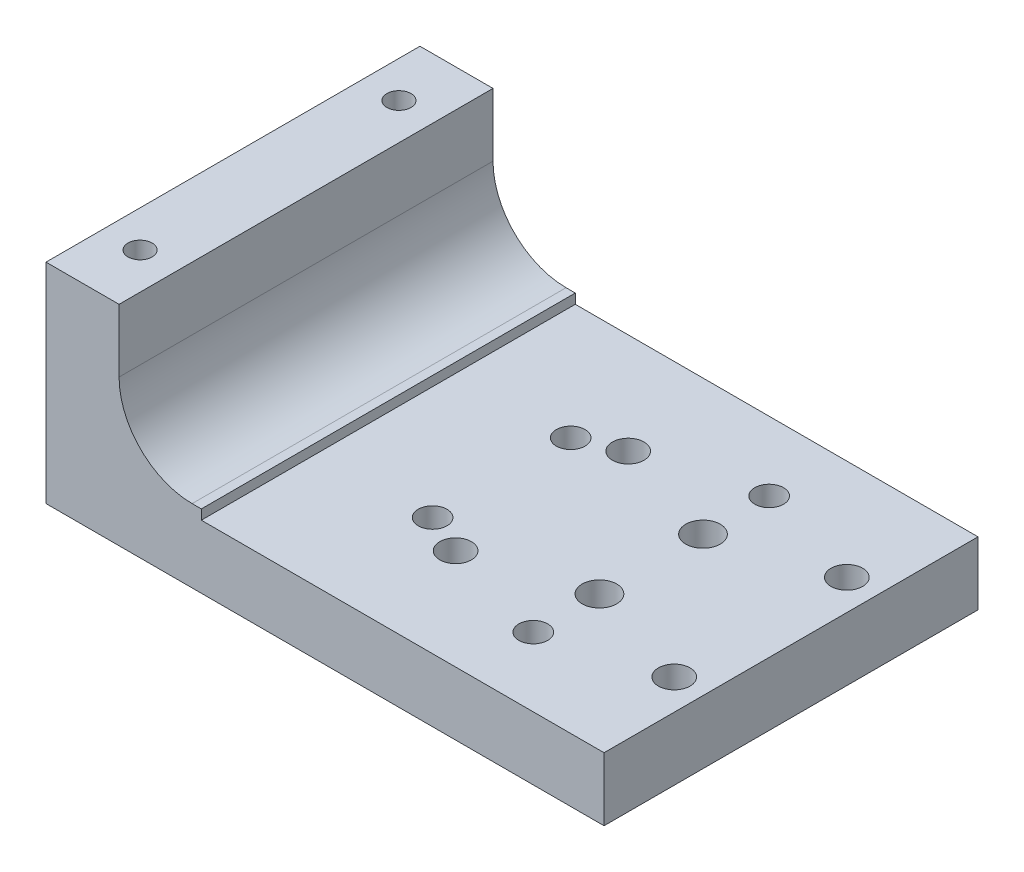
ISO-10303-21;
HEADER;
FILE_DESCRIPTION(('STEP AP214'),'2;1');
FILE_NAME('part.step','',(''),(''),'','','');
FILE_SCHEMA(('AUTOMOTIVE_DESIGN { 1 0 10303 214 1 1 1 1 }'));
ENDSEC;
DATA;
#1=APPLICATION_CONTEXT('core data for automotive mechanical design processes');
#2=APPLICATION_PROTOCOL_DEFINITION('international standard','automotive_design',2000,#1);
#3=PRODUCT_CONTEXT('',#1,'mechanical');
#4=PRODUCT('Part','Part','',(#3));
#5=PRODUCT_RELATED_PRODUCT_CATEGORY('part','',(#4));
#6=PRODUCT_DEFINITION_FORMATION('','',#4);
#7=PRODUCT_DEFINITION_CONTEXT('part definition',#1,'design');
#8=PRODUCT_DEFINITION('design','',#6,#7);
#9=PRODUCT_DEFINITION_SHAPE('','',#8);
#10=(LENGTH_UNIT() NAMED_UNIT(*) SI_UNIT(.MILLI.,.METRE.));
#11=(NAMED_UNIT(*) PLANE_ANGLE_UNIT() SI_UNIT($,.RADIAN.));
#12=(NAMED_UNIT(*) SI_UNIT($,.STERADIAN.) SOLID_ANGLE_UNIT());
#13=UNCERTAINTY_MEASURE_WITH_UNIT(LENGTH_MEASURE(1.E-05),#10,'distance_accuracy_value','');
#14=(GEOMETRIC_REPRESENTATION_CONTEXT(3) GLOBAL_UNCERTAINTY_ASSIGNED_CONTEXT((#13)) GLOBAL_UNIT_ASSIGNED_CONTEXT((#10,
#11,#12)) REPRESENTATION_CONTEXT('',''));
#15=CARTESIAN_POINT('',(0.,0.,0.));
#16=DIRECTION('',(0.,0.,1.));
#17=DIRECTION('',(1.,0.,0.));
#18=AXIS2_PLACEMENT_3D('',#15,#16,#17);
#19=CARTESIAN_POINT('',(0.,0.,32.5));
#20=DIRECTION('',(1.,0.,0.));
#21=DIRECTION('',(0.,0.,-1.));
#22=AXIS2_PLACEMENT_3D('',#19,#20,#21);
#23=PLANE('',#22);
#24=DIRECTION('',(0.,-1.,0.));
#25=VECTOR('',#24,1.);
#26=CARTESIAN_POINT('',(0.,0.,-32.5));
#27=LINE('',#26,#25);
#28=CARTESIAN_POINT('',(0.,36.35,-32.5));
#29=VERTEX_POINT('',#28);
#30=CARTESIAN_POINT('',(0.,0.,-32.5));
#31=VERTEX_POINT('',#30);
#32=EDGE_CURVE('E138',#29,#31,#27,.T.);
#33=ORIENTED_EDGE('',*,*,#32,.T.);
#34=DIRECTION('',(0.,0.,-1.));
#35=VECTOR('',#34,1.);
#36=CARTESIAN_POINT('',(0.,0.,32.5));
#37=LINE('',#36,#35);
#38=CARTESIAN_POINT('',(0.,0.,32.5));
#39=VERTEX_POINT('',#38);
#40=EDGE_CURVE('E11',#39,#31,#37,.T.);
#41=ORIENTED_EDGE('',*,*,#40,.F.);
#42=DIRECTION('',(0.,-1.,0.));
#43=VECTOR('',#42,1.);
#44=CARTESIAN_POINT('',(0.,0.,32.5));
#45=LINE('',#44,#43);
#46=CARTESIAN_POINT('',(0.,36.35,32.5));
#47=VERTEX_POINT('',#46);
#48=EDGE_CURVE('E153',#47,#39,#45,.T.);
#49=ORIENTED_EDGE('',*,*,#48,.F.);
#50=DIRECTION('',(0.,0.,-1.));
#51=VECTOR('',#50,1.);
#52=CARTESIAN_POINT('',(0.,36.35,32.5));
#53=LINE('',#52,#51);
#54=EDGE_CURVE('E134',#47,#29,#53,.T.);
#55=ORIENTED_EDGE('',*,*,#54,.T.);
#56=EDGE_LOOP('',(#33,#41,#49,#55));
#57=FACE_BOUND('',#56,.T.);
#58=ADVANCED_FACE('F39',(#57),#23,.F.);
#59=CARTESIAN_POINT('',(0.,0.,32.5));
#60=DIRECTION('',(0.,1.,0.));
#61=DIRECTION('',(0.,0.,1.));
#62=AXIS2_PLACEMENT_3D('',#59,#60,#61);
#63=PLANE('',#62);
#64=CARTESIAN_POINT('',(72.7000000000001,0.,-9.));
#65=DIRECTION('',(0.,-1.,0.));
#66=DIRECTION('',(0.,0.,-1.));
#67=AXIS2_PLACEMENT_3D('',#64,#65,#66);
#68=CIRCLE('',#67,2.99999999999999);
#69=CARTESIAN_POINT('',(72.7000000000001,0.,-12.));
#70=VERTEX_POINT('',#69);
#71=EDGE_CURVE('E508',#70,#70,#68,.T.);
#72=ORIENTED_EDGE('',*,*,#71,.F.);
#73=EDGE_LOOP('',(#72));
#74=FACE_BOUND('',#73,.T.);
#75=CARTESIAN_POINT('',(72.7000000000001,0.,9.));
#76=DIRECTION('',(0.,-1.,0.));
#77=DIRECTION('',(0.,0.,-1.));
#78=AXIS2_PLACEMENT_3D('',#75,#76,#77);
#79=CIRCLE('',#78,2.99999999999999);
#80=CARTESIAN_POINT('',(72.7000000000001,0.,6.00000000000001));
#81=VERTEX_POINT('',#80);
#82=EDGE_CURVE('E173',#81,#81,#79,.T.);
#83=ORIENTED_EDGE('',*,*,#82,.F.);
#84=EDGE_LOOP('',(#83));
#85=FACE_BOUND('',#84,.T.);
#86=CARTESIAN_POINT('',(72.7000000000001,0.,20.5));
#87=DIRECTION('',(0.,-1.,0.));
#88=DIRECTION('',(0.,0.,-1.));
#89=AXIS2_PLACEMENT_3D('',#86,#87,#88);
#90=CIRCLE('',#89,2.49999999999999);
#91=CARTESIAN_POINT('',(72.7000000000001,0.,18.));
#92=VERTEX_POINT('',#91);
#93=EDGE_CURVE('E161',#92,#92,#90,.T.);
#94=ORIENTED_EDGE('',*,*,#93,.F.);
#95=EDGE_LOOP('',(#94));
#96=FACE_BOUND('',#95,.T.);
#97=CARTESIAN_POINT('',(72.7000000000001,0.,-20.5));
#98=DIRECTION('',(0.,-1.,0.));
#99=DIRECTION('',(0.,0.,-1.));
#100=AXIS2_PLACEMENT_3D('',#97,#98,#99);
#101=CIRCLE('',#100,2.49999999999999);
#102=CARTESIAN_POINT('',(72.7000000000001,0.,-23.));
#103=VERTEX_POINT('',#102);
#104=EDGE_CURVE('E160',#103,#103,#101,.T.);
#105=ORIENTED_EDGE('',*,*,#104,.F.);
#106=EDGE_LOOP('',(#105));
#107=FACE_BOUND('',#106,.T.);
#108=CARTESIAN_POINT('',(46.7000118304875,0.,12.0000000000001));
#109=DIRECTION('',(0.,-1.,0.));
#110=DIRECTION('',(0.,0.,-1.));
#111=AXIS2_PLACEMENT_3D('',#108,#109,#110);
#112=CIRCLE('',#111,2.49999999999999);
#113=CARTESIAN_POINT('',(46.7000118304875,0.,9.50000000000013));
#114=VERTEX_POINT('',#113);
#115=EDGE_CURVE('E179',#114,#114,#112,.T.);
#116=ORIENTED_EDGE('',*,*,#115,.F.);
#117=EDGE_LOOP('',(#116));
#118=FACE_BOUND('',#117,.T.);
#119=CARTESIAN_POINT('',(46.7000118304875,0.,-11.9999999999999));
#120=DIRECTION('',(0.,-1.,0.));
#121=DIRECTION('',(0.,0.,-1.));
#122=AXIS2_PLACEMENT_3D('',#119,#120,#121);
#123=CIRCLE('',#122,2.49999999999999);
#124=CARTESIAN_POINT('',(46.7000118304875,0.,-14.4999999999999));
#125=VERTEX_POINT('',#124);
#126=EDGE_CURVE('E185',#125,#125,#123,.T.);
#127=ORIENTED_EDGE('',*,*,#126,.F.);
#128=EDGE_LOOP('',(#127));
#129=FACE_BOUND('',#128,.T.);
#130=CARTESIAN_POINT('',(53.7,0.,15.0000000000001));
#131=DIRECTION('',(0.,-1.,0.));
#132=DIRECTION('',(0.,0.,-1.));
#133=AXIS2_PLACEMENT_3D('',#130,#131,#132);
#134=CIRCLE('',#133,2.74999999999999);
#135=CARTESIAN_POINT('',(53.7,0.,12.2500000000001));
#136=VERTEX_POINT('',#135);
#137=EDGE_CURVE('E203',#136,#136,#134,.T.);
#138=ORIENTED_EDGE('',*,*,#137,.F.);
#139=EDGE_LOOP('',(#138));
#140=FACE_BOUND('',#139,.T.);
#141=CARTESIAN_POINT('',(91.7,0.,15.0000000000001));
#142=DIRECTION('',(0.,-1.,0.));
#143=DIRECTION('',(0.,0.,-1.));
#144=AXIS2_PLACEMENT_3D('',#141,#142,#143);
#145=CIRCLE('',#144,2.74999999999999);
#146=CARTESIAN_POINT('',(91.7,0.,12.2500000000001));
#147=VERTEX_POINT('',#146);
#148=EDGE_CURVE('E209',#147,#147,#145,.T.);
#149=ORIENTED_EDGE('',*,*,#148,.F.);
#150=EDGE_LOOP('',(#149));
#151=FACE_BOUND('',#150,.T.);
#152=CARTESIAN_POINT('',(91.7,0.,-14.9999999999999));
#153=DIRECTION('',(0.,-1.,0.));
#154=DIRECTION('',(0.,0.,-1.));
#155=AXIS2_PLACEMENT_3D('',#152,#153,#154);
#156=CIRCLE('',#155,2.74999999999999);
#157=CARTESIAN_POINT('',(91.7,0.,-17.7499999999999));
#158=VERTEX_POINT('',#157);
#159=EDGE_CURVE('E215',#158,#158,#156,.T.);
#160=ORIENTED_EDGE('',*,*,#159,.F.);
#161=EDGE_LOOP('',(#160));
#162=FACE_BOUND('',#161,.T.);
#163=CARTESIAN_POINT('',(53.7,0.,-14.9999999999999));
#164=DIRECTION('',(0.,-1.,0.));
#165=DIRECTION('',(0.,0.,-1.));
#166=AXIS2_PLACEMENT_3D('',#163,#164,#165);
#167=CIRCLE('',#166,2.74999999999999);
#168=CARTESIAN_POINT('',(53.7,0.,-17.7499999999999));
#169=VERTEX_POINT('',#168);
#170=EDGE_CURVE('E221',#169,#169,#167,.T.);
#171=ORIENTED_EDGE('',*,*,#170,.F.);
#172=EDGE_LOOP('',(#171));
#173=FACE_BOUND('',#172,.T.);
#174=DIRECTION('',(1.,0.,0.));
#175=VECTOR('',#174,1.);
#176=CARTESIAN_POINT('',(0.,0.,-32.5));
#177=LINE('',#176,#175);
#178=CARTESIAN_POINT('',(97.,0.,-32.5));
#179=VERTEX_POINT('',#178);
#180=EDGE_CURVE('E141',#31,#179,#177,.T.);
#181=ORIENTED_EDGE('',*,*,#180,.T.);
#182=DIRECTION('',(0.,0.,-1.));
#183=VECTOR('',#182,1.);
#184=CARTESIAN_POINT('',(97.,0.,32.5));
#185=LINE('',#184,#183);
#186=CARTESIAN_POINT('',(97.,0.,32.5));
#187=VERTEX_POINT('',#186);
#188=EDGE_CURVE('E47',#187,#179,#185,.T.);
#189=ORIENTED_EDGE('',*,*,#188,.F.);
#190=DIRECTION('',(1.,0.,0.));
#191=VECTOR('',#190,1.);
#192=CARTESIAN_POINT('',(0.,0.,32.5));
#193=LINE('',#192,#191);
#194=EDGE_CURVE('E99',#39,#187,#193,.T.);
#195=ORIENTED_EDGE('',*,*,#194,.F.);
#196=ORIENTED_EDGE('',*,*,#40,.T.);
#197=EDGE_LOOP('',(#181,#189,#195,#196));
#198=FACE_BOUND('',#197,.T.);
#199=ADVANCED_FACE('F310',(#74,#85,#96,#107,#118,#129,#140,#151,#162,#173,#198),#63,.F.);
#200=CARTESIAN_POINT('',(97.,12.7,32.5));
#201=DIRECTION('',(-1.,0.,0.));
#202=DIRECTION('',(0.,0.,1.));
#203=AXIS2_PLACEMENT_3D('',#200,#201,#202);
#204=PLANE('',#203);
#205=DIRECTION('',(0.,1.,0.));
#206=VECTOR('',#205,1.);
#207=CARTESIAN_POINT('',(97.,12.7,-32.5));
#208=LINE('',#207,#206);
#209=CARTESIAN_POINT('',(97.,11.,-32.5));
#210=VERTEX_POINT('',#209);
#211=EDGE_CURVE('E144',#179,#210,#208,.T.);
#212=ORIENTED_EDGE('',*,*,#211,.T.);
#213=DIRECTION('',(0.,0.,-1.));
#214=VECTOR('',#213,1.);
#215=CARTESIAN_POINT('',(97.,11.,32.5));
#216=LINE('',#215,#214);
#217=CARTESIAN_POINT('',(97.,11.,32.5));
#218=VERTEX_POINT('',#217);
#219=EDGE_CURVE('E55',#218,#210,#216,.T.);
#220=ORIENTED_EDGE('',*,*,#219,.F.);
#221=DIRECTION('',(0.,1.,0.));
#222=VECTOR('',#221,1.);
#223=CARTESIAN_POINT('',(97.,12.7,32.5));
#224=LINE('',#223,#222);
#225=EDGE_CURVE('E245',#187,#218,#224,.T.);
#226=ORIENTED_EDGE('',*,*,#225,.F.);
#227=ORIENTED_EDGE('',*,*,#188,.T.);
#228=EDGE_LOOP('',(#212,#220,#226,#227));
#229=FACE_BOUND('',#228,.T.);
#230=ADVANCED_FACE('F252',(#229),#204,.F.);
#231=CARTESIAN_POINT('',(25.4,12.7,32.5));
#232=DIRECTION('',(0.,-1.,0.));
#233=DIRECTION('',(1.,0.,0.));
#234=AXIS2_PLACEMENT_3D('',#231,#232,#233);
#235=PLANE('',#234);
#236=DIRECTION('',(-1.,0.,0.));
#237=VECTOR('',#236,1.);
#238=CARTESIAN_POINT('',(25.4,12.7,32.5));
#239=LINE('',#238,#237);
#240=CARTESIAN_POINT('',(27.,12.7,32.5));
#241=VERTEX_POINT('',#240);
#242=CARTESIAN_POINT('',(25.4,12.7,32.5));
#243=VERTEX_POINT('',#242);
#244=EDGE_CURVE('E117',#241,#243,#239,.T.);
#245=ORIENTED_EDGE('',*,*,#244,.F.);
#246=DIRECTION('',(0.,0.,-1.));
#247=VECTOR('',#246,1.);
#248=CARTESIAN_POINT('',(27.,12.7,32.5));
#249=LINE('',#248,#247);
#250=CARTESIAN_POINT('',(27.,12.7,-32.5));
#251=VERTEX_POINT('',#250);
#252=EDGE_CURVE('E142',#241,#251,#249,.T.);
#253=ORIENTED_EDGE('',*,*,#252,.T.);
#254=DIRECTION('',(-1.,0.,0.));
#255=VECTOR('',#254,1.);
#256=CARTESIAN_POINT('',(25.4,12.7,-32.5));
#257=LINE('',#256,#255);
#258=CARTESIAN_POINT('',(25.4,12.7,-32.5));
#259=VERTEX_POINT('',#258);
#260=EDGE_CURVE('E147',#251,#259,#257,.T.);
#261=ORIENTED_EDGE('',*,*,#260,.T.);
#262=DIRECTION('',(0.,0.,-1.));
#263=VECTOR('',#262,1.);
#264=CARTESIAN_POINT('',(25.4,12.7,32.5));
#265=LINE('',#264,#263);
#266=EDGE_CURVE('E129',#243,#259,#265,.T.);
#267=ORIENTED_EDGE('',*,*,#266,.F.);
#268=EDGE_LOOP('',(#245,#253,#261,#267));
#269=FACE_BOUND('',#268,.T.);
#270=ADVANCED_FACE('F319',(#269),#235,.F.);
#271=CARTESIAN_POINT('',(25.4,25.4,32.5));
#272=DIRECTION('',(0.,0.,-1.));
#273=DIRECTION('',(-1.,0.,0.));
#274=AXIS2_PLACEMENT_3D('',#271,#272,#273);
#275=CYLINDRICAL_SURFACE('',#274,12.7);
#276=CARTESIAN_POINT('',(25.4,25.4,-32.5));
#277=DIRECTION('',(0.,0.,-1.));
#278=DIRECTION('',(1.,0.,0.));
#279=AXIS2_PLACEMENT_3D('',#276,#277,#278);
#280=CIRCLE('',#279,12.7);
#281=CARTESIAN_POINT('',(12.7,25.4,-32.5));
#282=VERTEX_POINT('',#281);
#283=EDGE_CURVE('E126',#259,#282,#280,.T.);
#284=ORIENTED_EDGE('',*,*,#283,.T.);
#285=DIRECTION('',(0.,0.,-1.));
#286=VECTOR('',#285,1.);
#287=CARTESIAN_POINT('',(12.7,25.4,32.5));
#288=LINE('',#287,#286);
#289=CARTESIAN_POINT('',(12.7,25.4,32.5));
#290=VERTEX_POINT('',#289);
#291=EDGE_CURVE('E123',#290,#282,#288,.T.);
#292=ORIENTED_EDGE('',*,*,#291,.F.);
#293=CARTESIAN_POINT('',(25.4,25.4,32.5));
#294=DIRECTION('',(0.,0.,-1.));
#295=DIRECTION('',(1.,0.,0.));
#296=AXIS2_PLACEMENT_3D('',#293,#294,#295);
#297=CIRCLE('',#296,12.7);
#298=EDGE_CURVE('E109',#243,#290,#297,.T.);
#299=ORIENTED_EDGE('',*,*,#298,.F.);
#300=ORIENTED_EDGE('',*,*,#266,.T.);
#301=EDGE_LOOP('',(#284,#292,#299,#300));
#302=FACE_BOUND('',#301,.T.);
#303=ADVANCED_FACE('F124',(#302),#275,.F.);
#304=CARTESIAN_POINT('',(12.7,36.35,32.5));
#305=DIRECTION('',(-1.,0.,0.));
#306=DIRECTION('',(0.,-1.,0.));
#307=AXIS2_PLACEMENT_3D('',#304,#305,#306);
#308=PLANE('',#307);
#309=DIRECTION('',(0.,1.,0.));
#310=VECTOR('',#309,1.);
#311=CARTESIAN_POINT('',(12.7,36.35,-32.5));
#312=LINE('',#311,#310);
#313=CARTESIAN_POINT('',(12.7,36.35,-32.5));
#314=VERTEX_POINT('',#313);
#315=EDGE_CURVE('E150',#282,#314,#312,.T.);
#316=ORIENTED_EDGE('',*,*,#315,.T.);
#317=DIRECTION('',(0.,0.,-1.));
#318=VECTOR('',#317,1.);
#319=CARTESIAN_POINT('',(12.7,36.35,32.5));
#320=LINE('',#319,#318);
#321=CARTESIAN_POINT('',(12.7,36.35,32.5));
#322=VERTEX_POINT('',#321);
#323=EDGE_CURVE('E130',#322,#314,#320,.T.);
#324=ORIENTED_EDGE('',*,*,#323,.F.);
#325=DIRECTION('',(0.,1.,0.));
#326=VECTOR('',#325,1.);
#327=CARTESIAN_POINT('',(12.7,36.35,32.5));
#328=LINE('',#327,#326);
#329=EDGE_CURVE('E114',#290,#322,#328,.T.);
#330=ORIENTED_EDGE('',*,*,#329,.F.);
#331=ORIENTED_EDGE('',*,*,#291,.T.);
#332=EDGE_LOOP('',(#316,#324,#330,#331));
#333=FACE_BOUND('',#332,.T.);
#334=ADVANCED_FACE('F132',(#333),#308,.F.);
#335=CARTESIAN_POINT('',(0.,36.35,32.5));
#336=DIRECTION('',(0.,-1.,0.));
#337=DIRECTION('',(1.,0.,0.));
#338=AXIS2_PLACEMENT_3D('',#335,#336,#337);
#339=PLANE('',#338);
#340=CARTESIAN_POINT('',(6.35000000000001,36.35,22.5));
#341=DIRECTION('',(0.,1.,0.));
#342=DIRECTION('',(0.,0.,1.));
#343=AXIS2_PLACEMENT_3D('',#340,#341,#342);
#344=CIRCLE('',#343,2.09999999999999);
#345=CARTESIAN_POINT('',(6.35000000000001,36.35,24.6));
#346=VERTEX_POINT('',#345);
#347=EDGE_CURVE('E194',#346,#346,#344,.T.);
#348=ORIENTED_EDGE('',*,*,#347,.F.);
#349=EDGE_LOOP('',(#348));
#350=FACE_BOUND('',#349,.T.);
#351=CARTESIAN_POINT('',(6.35000000000001,36.35,-22.5));
#352=DIRECTION('',(0.,1.,0.));
#353=DIRECTION('',(0.,0.,1.));
#354=AXIS2_PLACEMENT_3D('',#351,#352,#353);
#355=CIRCLE('',#354,2.09999999999999);
#356=CARTESIAN_POINT('',(6.35000000000001,36.35,-20.4));
#357=VERTEX_POINT('',#356);
#358=EDGE_CURVE('E200',#357,#357,#355,.T.);
#359=ORIENTED_EDGE('',*,*,#358,.F.);
#360=EDGE_LOOP('',(#359));
#361=FACE_BOUND('',#360,.T.);
#362=DIRECTION('',(-1.,0.,0.));
#363=VECTOR('',#362,1.);
#364=CARTESIAN_POINT('',(0.,36.35,-32.5));
#365=LINE('',#364,#363);
#366=EDGE_CURVE('E91',#314,#29,#365,.T.);
#367=ORIENTED_EDGE('',*,*,#366,.T.);
#368=ORIENTED_EDGE('',*,*,#54,.F.);
#369=DIRECTION('',(-1.,0.,0.));
#370=VECTOR('',#369,1.);
#371=CARTESIAN_POINT('',(0.,36.35,32.5));
#372=LINE('',#371,#370);
#373=EDGE_CURVE('E64',#322,#47,#372,.T.);
#374=ORIENTED_EDGE('',*,*,#373,.F.);
#375=ORIENTED_EDGE('',*,*,#323,.T.);
#376=EDGE_LOOP('',(#367,#368,#374,#375));
#377=FACE_BOUND('',#376,.T.);
#378=ADVANCED_FACE('F288',(#350,#361,#377),#339,.F.);
#379=CARTESIAN_POINT('',(25.4,25.4,32.5));
#380=DIRECTION('',(0.,0.,1.));
#381=DIRECTION('',(1.,0.,0.));
#382=AXIS2_PLACEMENT_3D('',#379,#380,#381);
#383=PLANE('',#382);
#384=DIRECTION('',(0.,1.,0.));
#385=VECTOR('',#384,1.);
#386=CARTESIAN_POINT('',(27.,12.7,32.5));
#387=LINE('',#386,#385);
#388=CARTESIAN_POINT('',(27.,11.,32.5));
#389=VERTEX_POINT('',#388);
#390=EDGE_CURVE('E231',#389,#241,#387,.T.);
#391=ORIENTED_EDGE('',*,*,#390,.T.);
#392=ORIENTED_EDGE('',*,*,#244,.T.);
#393=ORIENTED_EDGE('',*,*,#298,.T.);
#394=ORIENTED_EDGE('',*,*,#329,.T.);
#395=ORIENTED_EDGE('',*,*,#373,.T.);
#396=ORIENTED_EDGE('',*,*,#48,.T.);
#397=ORIENTED_EDGE('',*,*,#194,.T.);
#398=ORIENTED_EDGE('',*,*,#225,.T.);
#399=DIRECTION('',(-1.,0.,0.));
#400=VECTOR('',#399,1.);
#401=CARTESIAN_POINT('',(97.,11.,32.5));
#402=LINE('',#401,#400);
#403=EDGE_CURVE('E228',#218,#389,#402,.T.);
#404=ORIENTED_EDGE('',*,*,#403,.T.);
#405=EDGE_LOOP('',(#391,#392,#393,#394,#395,#396,#397,#398,#404));
#406=FACE_BOUND('',#405,.T.);
#407=ADVANCED_FACE('F112',(#406),#383,.T.);
#408=CARTESIAN_POINT('',(25.4,25.4,-32.5));
#409=DIRECTION('',(0.,0.,1.));
#410=DIRECTION('',(1.,0.,0.));
#411=AXIS2_PLACEMENT_3D('',#408,#409,#410);
#412=PLANE('',#411);
#413=ORIENTED_EDGE('',*,*,#260,.F.);
#414=DIRECTION('',(0.,1.,0.));
#415=VECTOR('',#414,1.);
#416=CARTESIAN_POINT('',(27.,12.7,-32.5));
#417=LINE('',#416,#415);
#418=CARTESIAN_POINT('',(27.,11.,-32.5));
#419=VERTEX_POINT('',#418);
#420=EDGE_CURVE('E232',#419,#251,#417,.T.);
#421=ORIENTED_EDGE('',*,*,#420,.F.);
#422=DIRECTION('',(-1.,0.,0.));
#423=VECTOR('',#422,1.);
#424=CARTESIAN_POINT('',(97.,11.,-32.5));
#425=LINE('',#424,#423);
#426=EDGE_CURVE('E227',#210,#419,#425,.T.);
#427=ORIENTED_EDGE('',*,*,#426,.F.);
#428=ORIENTED_EDGE('',*,*,#211,.F.);
#429=ORIENTED_EDGE('',*,*,#180,.F.);
#430=ORIENTED_EDGE('',*,*,#32,.F.);
#431=ORIENTED_EDGE('',*,*,#366,.F.);
#432=ORIENTED_EDGE('',*,*,#315,.F.);
#433=ORIENTED_EDGE('',*,*,#283,.F.);
#434=EDGE_LOOP('',(#413,#421,#427,#428,#429,#430,#431,#432,#433));
#435=FACE_BOUND('',#434,.T.);
#436=ADVANCED_FACE('F256',(#435),#412,.F.);
#437=CARTESIAN_POINT('',(27.,12.7,32.5));
#438=DIRECTION('',(-1.,0.,0.));
#439=DIRECTION('',(0.,0.,1.));
#440=AXIS2_PLACEMENT_3D('',#437,#438,#439);
#441=PLANE('',#440);
#442=ORIENTED_EDGE('',*,*,#420,.T.);
#443=ORIENTED_EDGE('',*,*,#252,.F.);
#444=ORIENTED_EDGE('',*,*,#390,.F.);
#445=DIRECTION('',(0.,0.,-1.));
#446=VECTOR('',#445,1.);
#447=CARTESIAN_POINT('',(27.,11.,32.5));
#448=LINE('',#447,#446);
#449=EDGE_CURVE('E239',#389,#419,#448,.T.);
#450=ORIENTED_EDGE('',*,*,#449,.T.);
#451=EDGE_LOOP('',(#442,#443,#444,#450));
#452=FACE_BOUND('',#451,.T.);
#453=ADVANCED_FACE('F320',(#452),#441,.F.);
#454=CARTESIAN_POINT('',(97.,11.,32.5));
#455=DIRECTION('',(0.,-1.,0.));
#456=DIRECTION('',(0.,0.,-1.));
#457=AXIS2_PLACEMENT_3D('',#454,#455,#456);
#458=PLANE('',#457);
#459=CARTESIAN_POINT('',(72.7000000000001,11.,-9.));
#460=DIRECTION('',(0.,-1.,0.));
#461=DIRECTION('',(0.,0.,-1.));
#462=AXIS2_PLACEMENT_3D('',#459,#460,#461);
#463=CIRCLE('',#462,2.99999999999999);
#464=CARTESIAN_POINT('',(72.7000000000001,11.,-12.));
#465=VERTEX_POINT('',#464);
#466=EDGE_CURVE('E42',#465,#465,#463,.T.);
#467=ORIENTED_EDGE('',*,*,#466,.T.);
#468=EDGE_LOOP('',(#467));
#469=FACE_BOUND('',#468,.T.);
#470=CARTESIAN_POINT('',(72.7000000000001,11.,9.));
#471=DIRECTION('',(0.,-1.,0.));
#472=DIRECTION('',(0.,0.,-1.));
#473=AXIS2_PLACEMENT_3D('',#470,#471,#472);
#474=CIRCLE('',#473,2.99999999999999);
#475=CARTESIAN_POINT('',(72.7000000000001,11.,6.00000000000001));
#476=VERTEX_POINT('',#475);
#477=EDGE_CURVE('E168',#476,#476,#474,.T.);
#478=ORIENTED_EDGE('',*,*,#477,.T.);
#479=EDGE_LOOP('',(#478));
#480=FACE_BOUND('',#479,.T.);
#481=CARTESIAN_POINT('',(72.7000000000001,11.,20.5));
#482=DIRECTION('',(0.,-1.,0.));
#483=DIRECTION('',(0.,0.,-1.));
#484=AXIS2_PLACEMENT_3D('',#481,#482,#483);
#485=CIRCLE('',#484,2.49999999999999);
#486=CARTESIAN_POINT('',(72.7000000000001,11.,18.));
#487=VERTEX_POINT('',#486);
#488=EDGE_CURVE('E158',#487,#487,#485,.T.);
#489=ORIENTED_EDGE('',*,*,#488,.T.);
#490=EDGE_LOOP('',(#489));
#491=FACE_BOUND('',#490,.T.);
#492=CARTESIAN_POINT('',(72.7000000000001,11.,-20.5));
#493=DIRECTION('',(0.,-1.,0.));
#494=DIRECTION('',(0.,0.,-1.));
#495=AXIS2_PLACEMENT_3D('',#492,#493,#494);
#496=CIRCLE('',#495,2.49999999999999);
#497=CARTESIAN_POINT('',(72.7000000000001,11.,-23.));
#498=VERTEX_POINT('',#497);
#499=EDGE_CURVE('E165',#498,#498,#496,.T.);
#500=ORIENTED_EDGE('',*,*,#499,.T.);
#501=EDGE_LOOP('',(#500));
#502=FACE_BOUND('',#501,.T.);
#503=CARTESIAN_POINT('',(46.7000118304875,11.,12.0000000000001));
#504=DIRECTION('',(0.,-1.,0.));
#505=DIRECTION('',(0.,0.,-1.));
#506=AXIS2_PLACEMENT_3D('',#503,#504,#505);
#507=CIRCLE('',#506,2.49999999999999);
#508=CARTESIAN_POINT('',(46.7000118304875,11.,9.50000000000013));
#509=VERTEX_POINT('',#508);
#510=EDGE_CURVE('E182',#509,#509,#507,.T.);
#511=ORIENTED_EDGE('',*,*,#510,.T.);
#512=EDGE_LOOP('',(#511));
#513=FACE_BOUND('',#512,.T.);
#514=CARTESIAN_POINT('',(46.7000118304875,11.,-11.9999999999999));
#515=DIRECTION('',(0.,-1.,0.));
#516=DIRECTION('',(0.,0.,-1.));
#517=AXIS2_PLACEMENT_3D('',#514,#515,#516);
#518=CIRCLE('',#517,2.49999999999999);
#519=CARTESIAN_POINT('',(46.7000118304875,11.,-14.4999999999999));
#520=VERTEX_POINT('',#519);
#521=EDGE_CURVE('E188',#520,#520,#518,.T.);
#522=ORIENTED_EDGE('',*,*,#521,.T.);
#523=EDGE_LOOP('',(#522));
#524=FACE_BOUND('',#523,.T.);
#525=CARTESIAN_POINT('',(53.7,11.,15.0000000000001));
#526=DIRECTION('',(0.,-1.,0.));
#527=DIRECTION('',(0.,0.,-1.));
#528=AXIS2_PLACEMENT_3D('',#525,#526,#527);
#529=CIRCLE('',#528,2.74999999999999);
#530=CARTESIAN_POINT('',(53.7,11.,12.2500000000001));
#531=VERTEX_POINT('',#530);
#532=EDGE_CURVE('E206',#531,#531,#529,.T.);
#533=ORIENTED_EDGE('',*,*,#532,.T.);
#534=EDGE_LOOP('',(#533));
#535=FACE_BOUND('',#534,.T.);
#536=CARTESIAN_POINT('',(91.7,11.,15.0000000000001));
#537=DIRECTION('',(0.,-1.,0.));
#538=DIRECTION('',(0.,0.,-1.));
#539=AXIS2_PLACEMENT_3D('',#536,#537,#538);
#540=CIRCLE('',#539,2.74999999999999);
#541=CARTESIAN_POINT('',(91.7,11.,12.2500000000001));
#542=VERTEX_POINT('',#541);
#543=EDGE_CURVE('E212',#542,#542,#540,.T.);
#544=ORIENTED_EDGE('',*,*,#543,.T.);
#545=EDGE_LOOP('',(#544));
#546=FACE_BOUND('',#545,.T.);
#547=CARTESIAN_POINT('',(91.7,11.,-14.9999999999999));
#548=DIRECTION('',(0.,-1.,0.));
#549=DIRECTION('',(0.,0.,-1.));
#550=AXIS2_PLACEMENT_3D('',#547,#548,#549);
#551=CIRCLE('',#550,2.74999999999999);
#552=CARTESIAN_POINT('',(91.7,11.,-17.7499999999999));
#553=VERTEX_POINT('',#552);
#554=EDGE_CURVE('E218',#553,#553,#551,.T.);
#555=ORIENTED_EDGE('',*,*,#554,.T.);
#556=EDGE_LOOP('',(#555));
#557=FACE_BOUND('',#556,.T.);
#558=CARTESIAN_POINT('',(53.7,11.,-14.9999999999999));
#559=DIRECTION('',(0.,-1.,0.));
#560=DIRECTION('',(0.,0.,-1.));
#561=AXIS2_PLACEMENT_3D('',#558,#559,#560);
#562=CIRCLE('',#561,2.74999999999999);
#563=CARTESIAN_POINT('',(53.7,11.,-17.7499999999999));
#564=VERTEX_POINT('',#563);
#565=EDGE_CURVE('E224',#564,#564,#562,.T.);
#566=ORIENTED_EDGE('',*,*,#565,.T.);
#567=EDGE_LOOP('',(#566));
#568=FACE_BOUND('',#567,.T.);
#569=ORIENTED_EDGE('',*,*,#426,.T.);
#570=ORIENTED_EDGE('',*,*,#449,.F.);
#571=ORIENTED_EDGE('',*,*,#403,.F.);
#572=ORIENTED_EDGE('',*,*,#219,.T.);
#573=EDGE_LOOP('',(#569,#570,#571,#572));
#574=FACE_BOUND('',#573,.T.);
#575=ADVANCED_FACE('F261',(#469,#480,#491,#502,#513,#524,#535,#546,#557,#568,#574),#458,.F.);
#576=CARTESIAN_POINT('',(53.7,0.,-14.9999999999999));
#577=DIRECTION('',(0.,-1.,0.));
#578=DIRECTION('',(0.,0.,-1.));
#579=AXIS2_PLACEMENT_3D('',#576,#577,#578);
#580=CYLINDRICAL_SURFACE('',#579,2.74999999999999);
#581=ORIENTED_EDGE('',*,*,#170,.T.);
#582=EDGE_LOOP('',(#581));
#583=FACE_BOUND('',#582,.T.);
#584=ORIENTED_EDGE('',*,*,#565,.F.);
#585=EDGE_LOOP('',(#584));
#586=FACE_BOUND('',#585,.T.);
#587=ADVANCED_FACE('F327',(#583,#586),#580,.F.);
#588=CARTESIAN_POINT('',(91.7,0.,-14.9999999999999));
#589=DIRECTION('',(0.,-1.,0.));
#590=DIRECTION('',(0.,0.,-1.));
#591=AXIS2_PLACEMENT_3D('',#588,#589,#590);
#592=CYLINDRICAL_SURFACE('',#591,2.74999999999999);
#593=ORIENTED_EDGE('',*,*,#159,.T.);
#594=EDGE_LOOP('',(#593));
#595=FACE_BOUND('',#594,.T.);
#596=ORIENTED_EDGE('',*,*,#554,.F.);
#597=EDGE_LOOP('',(#596));
#598=FACE_BOUND('',#597,.T.);
#599=ADVANCED_FACE('F387',(#595,#598),#592,.F.);
#600=CARTESIAN_POINT('',(91.7,0.,15.0000000000001));
#601=DIRECTION('',(0.,-1.,0.));
#602=DIRECTION('',(0.,0.,-1.));
#603=AXIS2_PLACEMENT_3D('',#600,#601,#602);
#604=CYLINDRICAL_SURFACE('',#603,2.74999999999999);
#605=ORIENTED_EDGE('',*,*,#148,.T.);
#606=EDGE_LOOP('',(#605));
#607=FACE_BOUND('',#606,.T.);
#608=ORIENTED_EDGE('',*,*,#543,.F.);
#609=EDGE_LOOP('',(#608));
#610=FACE_BOUND('',#609,.T.);
#611=ADVANCED_FACE('F305',(#607,#610),#604,.F.);
#612=CARTESIAN_POINT('',(53.7,0.,15.0000000000001));
#613=DIRECTION('',(0.,-1.,0.));
#614=DIRECTION('',(0.,0.,-1.));
#615=AXIS2_PLACEMENT_3D('',#612,#613,#614);
#616=CYLINDRICAL_SURFACE('',#615,2.74999999999999);
#617=ORIENTED_EDGE('',*,*,#137,.T.);
#618=EDGE_LOOP('',(#617));
#619=FACE_BOUND('',#618,.T.);
#620=ORIENTED_EDGE('',*,*,#532,.F.);
#621=EDGE_LOOP('',(#620));
#622=FACE_BOUND('',#621,.T.);
#623=ADVANCED_FACE('F296',(#619,#622),#616,.F.);
#624=CARTESIAN_POINT('',(6.35000000000001,36.35,-22.5));
#625=DIRECTION('',(0.,1.,0.));
#626=DIRECTION('',(0.,0.,1.));
#627=AXIS2_PLACEMENT_3D('',#624,#625,#626);
#628=CYLINDRICAL_SURFACE('',#627,2.09999999999999);
#629=CARTESIAN_POINT('',(6.35000000000001,17.3,-22.5));
#630=DIRECTION('',(0.,1.,0.));
#631=DIRECTION('',(0.,0.,1.));
#632=AXIS2_PLACEMENT_3D('',#629,#630,#631);
#633=CIRCLE('',#632,2.09999999999999);
#634=CARTESIAN_POINT('',(6.35000000000001,17.3,-20.4));
#635=VERTEX_POINT('',#634);
#636=EDGE_CURVE('E197',#635,#635,#633,.T.);
#637=ORIENTED_EDGE('',*,*,#636,.F.);
#638=EDGE_LOOP('',(#637));
#639=FACE_BOUND('',#638,.T.);
#640=ORIENTED_EDGE('',*,*,#358,.T.);
#641=EDGE_LOOP('',(#640));
#642=FACE_BOUND('',#641,.T.);
#643=ADVANCED_FACE('F294',(#639,#642),#628,.F.);
#644=CARTESIAN_POINT('',(6.35000000000001,17.3,-22.5));
#645=DIRECTION('',(0.,1.,0.));
#646=DIRECTION('',(0.,0.,1.));
#647=AXIS2_PLACEMENT_3D('',#644,#645,#646);
#648=CONICAL_SURFACE('',#647,2.09999999999999,1.02974425867665);
#649=CARTESIAN_POINT('',(6.35,16.0381927000421,-22.5));
#650=VERTEX_POINT('',#649);
#651=VERTEX_LOOP('',#650);
#652=FACE_BOUND('',#651,.T.);
#653=ORIENTED_EDGE('',*,*,#636,.T.);
#654=EDGE_LOOP('',(#653));
#655=FACE_BOUND('',#654,.T.);
#656=ADVANCED_FACE('F284',(#652,#655),#648,.F.);
#657=CARTESIAN_POINT('',(6.35000000000001,36.35,22.5));
#658=DIRECTION('',(0.,1.,0.));
#659=DIRECTION('',(0.,0.,1.));
#660=AXIS2_PLACEMENT_3D('',#657,#658,#659);
#661=CYLINDRICAL_SURFACE('',#660,2.09999999999999);
#662=CARTESIAN_POINT('',(6.35000000000001,17.3,22.5));
#663=DIRECTION('',(0.,1.,0.));
#664=DIRECTION('',(0.,0.,1.));
#665=AXIS2_PLACEMENT_3D('',#662,#663,#664);
#666=CIRCLE('',#665,2.09999999999999);
#667=CARTESIAN_POINT('',(6.35000000000001,17.3,24.6));
#668=VERTEX_POINT('',#667);
#669=EDGE_CURVE('E191',#668,#668,#666,.T.);
#670=ORIENTED_EDGE('',*,*,#669,.F.);
#671=EDGE_LOOP('',(#670));
#672=FACE_BOUND('',#671,.T.);
#673=ORIENTED_EDGE('',*,*,#347,.T.);
#674=EDGE_LOOP('',(#673));
#675=FACE_BOUND('',#674,.T.);
#676=ADVANCED_FACE('F278',(#672,#675),#661,.F.);
#677=CARTESIAN_POINT('',(6.35000000000001,17.3,22.5));
#678=DIRECTION('',(0.,1.,0.));
#679=DIRECTION('',(0.,0.,1.));
#680=AXIS2_PLACEMENT_3D('',#677,#678,#679);
#681=CONICAL_SURFACE('',#680,2.09999999999999,1.02974425867665);
#682=CARTESIAN_POINT('',(6.35000000000001,16.0381927000421,22.5));
#683=VERTEX_POINT('',#682);
#684=VERTEX_LOOP('',#683);
#685=FACE_BOUND('',#684,.T.);
#686=ORIENTED_EDGE('',*,*,#669,.T.);
#687=EDGE_LOOP('',(#686));
#688=FACE_BOUND('',#687,.T.);
#689=ADVANCED_FACE('F274',(#685,#688),#681,.F.);
#690=CARTESIAN_POINT('',(46.7000118304875,0.,-11.9999999999999));
#691=DIRECTION('',(0.,-1.,0.));
#692=DIRECTION('',(0.,0.,-1.));
#693=AXIS2_PLACEMENT_3D('',#690,#691,#692);
#694=CYLINDRICAL_SURFACE('',#693,2.49999999999999);
#695=ORIENTED_EDGE('',*,*,#521,.F.);
#696=EDGE_LOOP('',(#695));
#697=FACE_BOUND('',#696,.T.);
#698=ORIENTED_EDGE('',*,*,#126,.T.);
#699=EDGE_LOOP('',(#698));
#700=FACE_BOUND('',#699,.T.);
#701=ADVANCED_FACE('F277',(#697,#700),#694,.F.);
#702=CARTESIAN_POINT('',(46.7000118304875,0.,12.0000000000001));
#703=DIRECTION('',(0.,-1.,0.));
#704=DIRECTION('',(0.,0.,-1.));
#705=AXIS2_PLACEMENT_3D('',#702,#703,#704);
#706=CYLINDRICAL_SURFACE('',#705,2.49999999999999);
#707=ORIENTED_EDGE('',*,*,#510,.F.);
#708=EDGE_LOOP('',(#707));
#709=FACE_BOUND('',#708,.T.);
#710=ORIENTED_EDGE('',*,*,#115,.T.);
#711=EDGE_LOOP('',(#710));
#712=FACE_BOUND('',#711,.T.);
#713=ADVANCED_FACE('F440',(#709,#712),#706,.F.);
#714=CARTESIAN_POINT('',(72.7000000000001,0.,-20.5));
#715=DIRECTION('',(0.,-1.,0.));
#716=DIRECTION('',(0.,0.,-1.));
#717=AXIS2_PLACEMENT_3D('',#714,#715,#716);
#718=CYLINDRICAL_SURFACE('',#717,2.49999999999999);
#719=ORIENTED_EDGE('',*,*,#104,.T.);
#720=EDGE_LOOP('',(#719));
#721=FACE_BOUND('',#720,.T.);
#722=ORIENTED_EDGE('',*,*,#499,.F.);
#723=EDGE_LOOP('',(#722));
#724=FACE_BOUND('',#723,.T.);
#725=ADVANCED_FACE('F449',(#721,#724),#718,.F.);
#726=CARTESIAN_POINT('',(72.7000000000001,0.,20.5));
#727=DIRECTION('',(0.,-1.,0.));
#728=DIRECTION('',(0.,0.,-1.));
#729=AXIS2_PLACEMENT_3D('',#726,#727,#728);
#730=CYLINDRICAL_SURFACE('',#729,2.49999999999999);
#731=ORIENTED_EDGE('',*,*,#93,.T.);
#732=EDGE_LOOP('',(#731));
#733=FACE_BOUND('',#732,.T.);
#734=ORIENTED_EDGE('',*,*,#488,.F.);
#735=EDGE_LOOP('',(#734));
#736=FACE_BOUND('',#735,.T.);
#737=ADVANCED_FACE('F458',(#733,#736),#730,.F.);
#738=CARTESIAN_POINT('',(72.7000000000001,0.,9.));
#739=DIRECTION('',(0.,-1.,0.));
#740=DIRECTION('',(0.,0.,-1.));
#741=AXIS2_PLACEMENT_3D('',#738,#739,#740);
#742=CYLINDRICAL_SURFACE('',#741,2.99999999999999);
#743=ORIENTED_EDGE('',*,*,#82,.T.);
#744=EDGE_LOOP('',(#743));
#745=FACE_BOUND('',#744,.T.);
#746=ORIENTED_EDGE('',*,*,#477,.F.);
#747=EDGE_LOOP('',(#746));
#748=FACE_BOUND('',#747,.T.);
#749=ADVANCED_FACE('F468',(#745,#748),#742,.F.);
#750=CARTESIAN_POINT('',(72.7000000000001,0.,-9.));
#751=DIRECTION('',(0.,-1.,0.));
#752=DIRECTION('',(0.,0.,-1.));
#753=AXIS2_PLACEMENT_3D('',#750,#751,#752);
#754=CYLINDRICAL_SURFACE('',#753,2.99999999999999);
#755=ORIENTED_EDGE('',*,*,#71,.T.);
#756=EDGE_LOOP('',(#755));
#757=FACE_BOUND('',#756,.T.);
#758=ORIENTED_EDGE('',*,*,#466,.F.);
#759=EDGE_LOOP('',(#758));
#760=FACE_BOUND('',#759,.T.);
#761=ADVANCED_FACE('F477',(#757,#760),#754,.F.);
#762=CLOSED_SHELL('',(#58,#199,#230,#270,#303,#334,#378,#407,#436,#453,#575,#587,#599,#611,#623,
#643,#656,#676,#689,#701,#713,#725,#737,#749,#761));
#763=MANIFOLD_SOLID_BREP('B2',#762);
#764=ADVANCED_BREP_SHAPE_REPRESENTATION('',(#18,#763),#14);
#765=SHAPE_DEFINITION_REPRESENTATION(#9,#764);
ENDSEC;
END-ISO-10303-21;
